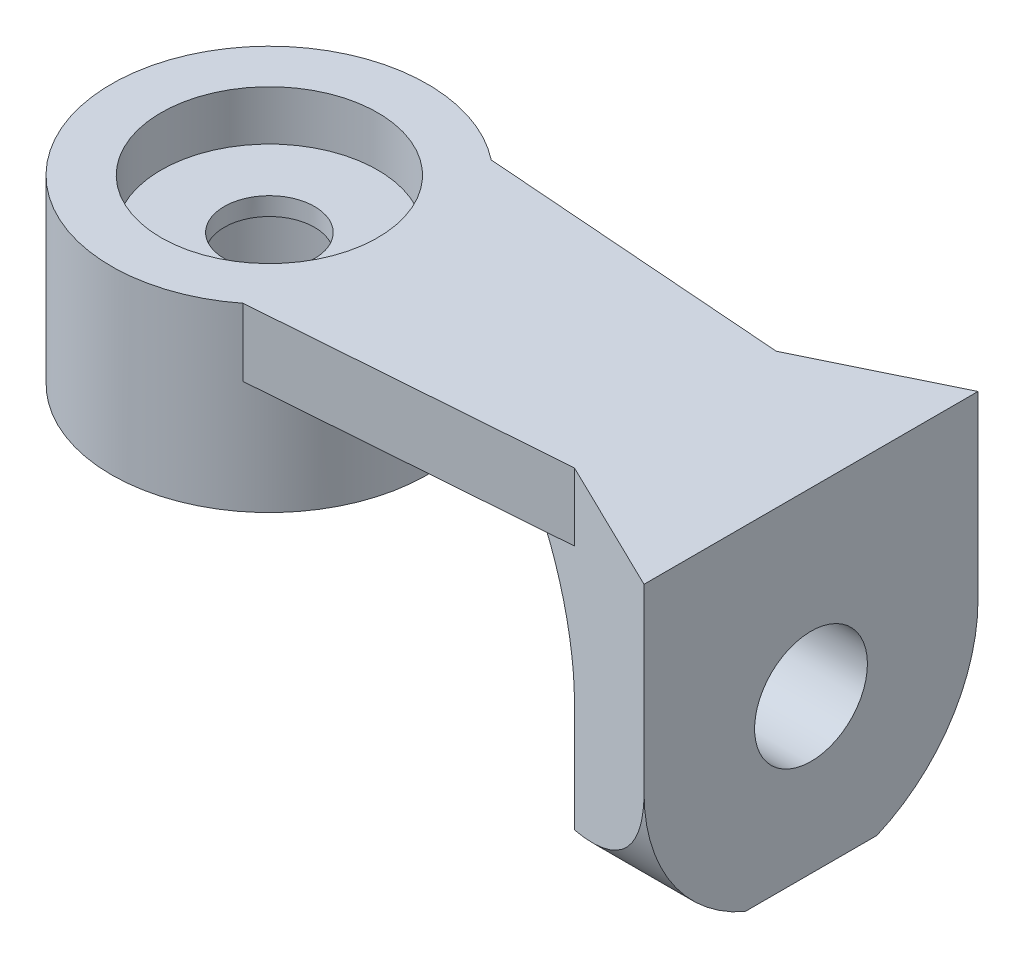
ISO-10303-21;
HEADER;
FILE_DESCRIPTION(('STEP AP214'),'2;1');
FILE_NAME('part.step','',(''),(''),'','','');
FILE_SCHEMA(('AUTOMOTIVE_DESIGN { 1 0 10303 214 1 1 1 1 }'));
ENDSEC;
DATA;
#1=APPLICATION_CONTEXT('core data for automotive mechanical design processes');
#2=APPLICATION_PROTOCOL_DEFINITION('international standard','automotive_design',2000,#1);
#3=PRODUCT_CONTEXT('',#1,'mechanical');
#4=PRODUCT('Part','Part','',(#3));
#5=PRODUCT_RELATED_PRODUCT_CATEGORY('part','',(#4));
#6=PRODUCT_DEFINITION_FORMATION('','',#4);
#7=PRODUCT_DEFINITION_CONTEXT('part definition',#1,'design');
#8=PRODUCT_DEFINITION('design','',#6,#7);
#9=PRODUCT_DEFINITION_SHAPE('','',#8);
#10=(LENGTH_UNIT() NAMED_UNIT(*) SI_UNIT(.MILLI.,.METRE.));
#11=(NAMED_UNIT(*) PLANE_ANGLE_UNIT() SI_UNIT($,.RADIAN.));
#12=(NAMED_UNIT(*) SI_UNIT($,.STERADIAN.) SOLID_ANGLE_UNIT());
#13=UNCERTAINTY_MEASURE_WITH_UNIT(LENGTH_MEASURE(1.E-05),#10,'distance_accuracy_value','');
#14=(GEOMETRIC_REPRESENTATION_CONTEXT(3) GLOBAL_UNCERTAINTY_ASSIGNED_CONTEXT((#13)) GLOBAL_UNIT_ASSIGNED_CONTEXT((#10,
#11,#12)) REPRESENTATION_CONTEXT('',''));
#15=CARTESIAN_POINT('',(0.,0.,0.));
#16=DIRECTION('',(0.,0.,1.));
#17=DIRECTION('',(1.,0.,0.));
#18=AXIS2_PLACEMENT_3D('',#15,#16,#17);
#19=CARTESIAN_POINT('',(12.0000000000011,-3.4,3.69999999999387));
#20=DIRECTION('',(-0.437724250234858,0.,0.899109270754302));
#21=DIRECTION('',(0.899109270754301,0.,0.437724250234858));
#22=AXIS2_PLACEMENT_3D('',#19,#20,#21);
#23=PLANE('',#22);
#24=DIRECTION('',(-0.00082590234464233,0.999999578106783,-0.000402084036206725));
#25=VECTOR('',#24,1.);
#26=CARTESIAN_POINT('',(9.00000253135987,-3.40306496005688,2.23947491657906));
#27=LINE('',#26,#25);
#28=CARTESIAN_POINT('',(8.99962457198454,-2.94543311250702,2.23929091004107));
#29=VERTEX_POINT('',#28);
#30=CARTESIAN_POINT('',(8.99760283584608,-0.497522292765807,2.23830664376314));
#31=VERTEX_POINT('',#30);
#32=EDGE_CURVE('E158',#29,#31,#27,.T.);
#33=ORIENTED_EDGE('',*,*,#32,.F.);
#34=CARTESIAN_POINT('',(4.4,0.,0.));
#35=DIRECTION('',(-0.437724250234858,0.,0.899109270754302));
#36=DIRECTION('',(0.899109270754301,0.,0.437724250234858));
#37=AXIS2_PLACEMENT_3D('',#34,#35,#36);
#38=ELLIPSE('',#37,8.45281018362799,3.70000000000613);
#39=CARTESIAN_POINT('',(12.0000000000011,1.92911441682681E-11,3.69999999999387));
#40=VERTEX_POINT('',#39);
#41=EDGE_CURVE('E255',#29,#40,#38,.T.);
#42=ORIENTED_EDGE('',*,*,#41,.T.);
#43=DIRECTION('',(0.,1.,0.));
#44=VECTOR('',#43,1.);
#45=CARTESIAN_POINT('',(12.0000000000011,-3.4,3.69999999999387));
#46=LINE('',#45,#44);
#47=CARTESIAN_POINT('',(12.0000000000011,4.,3.69999999999387));
#48=VERTEX_POINT('',#47);
#49=EDGE_CURVE('E184',#40,#48,#46,.T.);
#50=ORIENTED_EDGE('',*,*,#49,.T.);
#51=DIRECTION('',(0.899109270754302,0.,0.437724250234858));
#52=VECTOR('',#51,1.);
#53=CARTESIAN_POINT('',(12.0000000000011,4.,3.69999999999387));
#54=LINE('',#53,#52);
#55=CARTESIAN_POINT('',(8.99512717411191,4.,2.23710138739256));
#56=VERTEX_POINT('',#55);
#57=EDGE_CURVE('E176',#56,#48,#54,.T.);
#58=ORIENTED_EDGE('',*,*,#57,.F.);
#59=DIRECTION('',(0.,-1.,0.));
#60=VECTOR('',#59,1.);
#61=CARTESIAN_POINT('',(8.99512717411191,2.5,2.23710138739256));
#62=LINE('',#61,#60);
#63=CARTESIAN_POINT('',(8.99512717411191,2.5,2.23710138739256));
#64=VERTEX_POINT('',#63);
#65=EDGE_CURVE('E189',#56,#64,#62,.T.);
#66=ORIENTED_EDGE('',*,*,#65,.T.);
#67=DIRECTION('',(0.899109270754301,0.,0.437724250234858));
#68=VECTOR('',#67,1.);
#69=CARTESIAN_POINT('',(0.84305108467214,2.5,-1.7316724982486));
#70=LINE('',#69,#68);
#71=CARTESIAN_POINT('',(5.99760385901843,2.5,0.777780826099676));
#72=VERTEX_POINT('',#71);
#73=EDGE_CURVE('E237',#72,#64,#70,.T.);
#74=ORIENTED_EDGE('',*,*,#73,.F.);
#75=CARTESIAN_POINT('',(5.99760385901845,-0.5,0.777780826099685));
#76=DIRECTION('',(-0.437724250234858,0.,0.899109270754302));
#77=DIRECTION('',(0.899109270754301,0.,0.437724250234858));
#78=AXIS2_PLACEMENT_3D('',#75,#76,#77);
#79=ELLIPSE('',#78,3.33663559878898,3.);
#80=EDGE_CURVE('E168',#72,#31,#79,.F.);
#81=ORIENTED_EDGE('',*,*,#80,.T.);
#82=EDGE_LOOP('',(#33,#42,#50,#58,#66,#74,#81));
#83=FACE_BOUND('',#82,.T.);
#84=ADVANCED_FACE('F49',(#83),#23,.T.);
#85=CARTESIAN_POINT('',(4.4,-3.4,0.));
#86=DIRECTION('',(-0.43772425023603,0.,-0.899109270753731));
#87=DIRECTION('',(-0.89910927075373,0.,0.43772425023603));
#88=AXIS2_PLACEMENT_3D('',#85,#86,#87);
#89=PLANE('',#88);
#90=DIRECTION('',(0.,1.,0.));
#91=VECTOR('',#90,1.);
#92=CARTESIAN_POINT('',(12.0000000000011,-3.4,-3.70000000000613));
#93=LINE('',#92,#91);
#94=CARTESIAN_POINT('',(12.0000000000011,0.,-3.70000000000613));
#95=VERTEX_POINT('',#94);
#96=CARTESIAN_POINT('',(12.0000000000011,4.,-3.70000000000613));
#97=VERTEX_POINT('',#96);
#98=EDGE_CURVE('E175',#95,#97,#93,.T.);
#99=ORIENTED_EDGE('',*,*,#98,.F.);
#100=CARTESIAN_POINT('',(4.4,0.,0.));
#101=DIRECTION('',(-0.43772425023603,0.,-0.899109270753731));
#102=DIRECTION('',(0.899109270753731,0.,-0.43772425023603));
#103=AXIS2_PLACEMENT_3D('',#100,#101,#102);
#104=ELLIPSE('',#103,8.45281018360534,3.70000000000613);
#105=CARTESIAN_POINT('',(8.99962457198454,-2.94543311250138,-2.23929091004849));
#106=VERTEX_POINT('',#105);
#107=EDGE_CURVE('E163',#95,#106,#104,.T.);
#108=ORIENTED_EDGE('',*,*,#107,.T.);
#109=DIRECTION('',(0.00082590234464233,-0.999999578106784,-0.000402084036208058));
#110=VECTOR('',#109,1.);
#111=CARTESIAN_POINT('',(8.99999611858433,-3.39530039457945,-2.23947179457734));
#112=LINE('',#111,#110);
#113=CARTESIAN_POINT('',(8.99760283584608,-0.497522292765807,-2.23830664377056));
#114=VERTEX_POINT('',#113);
#115=EDGE_CURVE('E156',#114,#106,#112,.T.);
#116=ORIENTED_EDGE('',*,*,#115,.F.);
#117=CARTESIAN_POINT('',(5.99760385901845,-0.5,-0.777780826102263));
#118=DIRECTION('',(-0.43772425023603,0.,-0.899109270753731));
#119=DIRECTION('',(-0.89910927075373,0.,0.43772425023603));
#120=AXIS2_PLACEMENT_3D('',#117,#118,#119);
#121=ELLIPSE('',#120,3.3366355987911,3.);
#122=CARTESIAN_POINT('',(5.99760385901843,2.5,-0.777780826102253));
#123=VERTEX_POINT('',#122);
#124=EDGE_CURVE('E155',#114,#123,#121,.F.);
#125=ORIENTED_EDGE('',*,*,#124,.T.);
#126=DIRECTION('',(-0.89910927075373,0.,0.43772425023603));
#127=VECTOR('',#126,1.);
#128=CARTESIAN_POINT('',(0.843051084676658,2.5,1.73167249825214));
#129=LINE('',#128,#127);
#130=CARTESIAN_POINT('',(8.99512717409872,2.5,-2.23710138739355));
#131=VERTEX_POINT('',#130);
#132=EDGE_CURVE('E230',#131,#123,#129,.T.);
#133=ORIENTED_EDGE('',*,*,#132,.F.);
#134=DIRECTION('',(0.,1.,0.));
#135=VECTOR('',#134,1.);
#136=CARTESIAN_POINT('',(8.99512717409872,2.5,-2.23710138739355));
#137=LINE('',#136,#135);
#138=CARTESIAN_POINT('',(8.99512717409871,4.,-2.23710138739355));
#139=VERTEX_POINT('',#138);
#140=EDGE_CURVE('E186',#131,#139,#137,.T.);
#141=ORIENTED_EDGE('',*,*,#140,.T.);
#142=DIRECTION('',(-0.89910927075373,0.,0.43772425023603));
#143=VECTOR('',#142,1.);
#144=CARTESIAN_POINT('',(4.4,4.,0.));
#145=LINE('',#144,#143);
#146=EDGE_CURVE('E179',#97,#139,#145,.T.);
#147=ORIENTED_EDGE('',*,*,#146,.F.);
#148=EDGE_LOOP('',(#99,#108,#116,#125,#133,#141,#147));
#149=FACE_BOUND('',#148,.T.);
#150=ADVANCED_FACE('F253',(#149),#89,.T.);
#151=CARTESIAN_POINT('',(12.0000000000011,-3.4,0.));
#152=DIRECTION('',(1.,0.,0.));
#153=DIRECTION('',(0.,0.,-1.));
#154=AXIS2_PLACEMENT_3D('',#151,#152,#153);
#155=PLANE('',#154);
#156=CARTESIAN_POINT('',(12.0000000000011,0.,0.));
#157=DIRECTION('',(1.,0.,0.));
#158=DIRECTION('',(0.,0.,-1.));
#159=AXIS2_PLACEMENT_3D('',#156,#157,#158);
#160=CIRCLE('',#159,1.25);
#161=CARTESIAN_POINT('',(12.0000000000011,0.,-1.25));
#162=VERTEX_POINT('',#161);
#163=EDGE_CURVE('E151',#162,#162,#160,.T.);
#164=ORIENTED_EDGE('',*,*,#163,.F.);
#165=EDGE_LOOP('',(#164));
#166=FACE_BOUND('',#165,.T.);
#167=ORIENTED_EDGE('',*,*,#49,.F.);
#168=CARTESIAN_POINT('',(12.0000000000011,0.,0.));
#169=DIRECTION('',(1.,0.,0.));
#170=DIRECTION('',(0.,0.,-1.));
#171=AXIS2_PLACEMENT_3D('',#168,#169,#170);
#172=CIRCLE('',#171,3.70000000000613);
#173=CARTESIAN_POINT('',(12.0000000000011,-3.4,1.45945195194819));
#174=VERTEX_POINT('',#173);
#175=EDGE_CURVE('E263',#40,#174,#172,.T.);
#176=ORIENTED_EDGE('',*,*,#175,.T.);
#177=DIRECTION('',(0.,0.,-1.));
#178=VECTOR('',#177,1.);
#179=CARTESIAN_POINT('',(12.0000000000011,-3.4,0.));
#180=LINE('',#179,#178);
#181=CARTESIAN_POINT('',(12.0000000000011,-3.4,-1.45945195194819));
#182=VERTEX_POINT('',#181);
#183=EDGE_CURVE('E172',#174,#182,#180,.T.);
#184=ORIENTED_EDGE('',*,*,#183,.T.);
#185=EDGE_CURVE('E150',#182,#95,#172,.T.);
#186=ORIENTED_EDGE('',*,*,#185,.T.);
#187=ORIENTED_EDGE('',*,*,#98,.T.);
#188=DIRECTION('',(0.,0.,-1.));
#189=VECTOR('',#188,1.);
#190=CARTESIAN_POINT('',(12.0000000000011,4.,0.));
#191=LINE('',#190,#189);
#192=EDGE_CURVE('E171',#48,#97,#191,.T.);
#193=ORIENTED_EDGE('',*,*,#192,.F.);
#194=EDGE_LOOP('',(#167,#176,#184,#186,#187,#193));
#195=FACE_BOUND('',#194,.T.);
#196=ADVANCED_FACE('F270',(#166,#195),#155,.T.);
#197=CARTESIAN_POINT('',(0.,-3.4,0.));
#198=DIRECTION('',(0.,-1.,0.));
#199=DIRECTION('',(0.,0.,-1.));
#200=AXIS2_PLACEMENT_3D('',#197,#198,#199);
#201=PLANE('',#200);
#202=DIRECTION('',(0.,0.,1.));
#203=VECTOR('',#202,1.);
#204=CARTESIAN_POINT('',(9.00000000000111,-3.4,0.));
#205=LINE('',#204,#203);
#206=CARTESIAN_POINT('',(9.00000000000111,-3.4,-1.45945195194819));
#207=VERTEX_POINT('',#206);
#208=CARTESIAN_POINT('',(9.00000000000111,-3.4,1.45945195194819));
#209=VERTEX_POINT('',#208);
#210=EDGE_CURVE('E240',#207,#209,#205,.T.);
#211=ORIENTED_EDGE('',*,*,#210,.F.);
#212=DIRECTION('',(1.,0.,0.));
#213=VECTOR('',#212,1.);
#214=CARTESIAN_POINT('',(4.60000000000111,-3.4,-1.45945195194819));
#215=LINE('',#214,#213);
#216=EDGE_CURVE('E74',#207,#182,#215,.T.);
#217=ORIENTED_EDGE('',*,*,#216,.T.);
#218=ORIENTED_EDGE('',*,*,#183,.F.);
#219=DIRECTION('',(1.,0.,0.));
#220=VECTOR('',#219,1.);
#221=CARTESIAN_POINT('',(4.60000000000111,-3.4,1.45945195194819));
#222=LINE('',#221,#220);
#223=EDGE_CURVE('E259',#174,#209,#222,.F.);
#224=ORIENTED_EDGE('',*,*,#223,.T.);
#225=EDGE_LOOP('',(#211,#217,#218,#224));
#226=FACE_BOUND('',#225,.T.);
#227=ADVANCED_FACE('F273',(#226),#201,.T.);
#228=CARTESIAN_POINT('',(8.99718579372691,0.00743079997722582,-3.70000000000613));
#229=DIRECTION('',(0.999999658942545,0.000825902411404804,0.));
#230=DIRECTION('',(-0.000825902411404804,0.999999658942545,0.));
#231=AXIS2_PLACEMENT_3D('',#228,#229,#230);
#232=PLANE('',#231);
#233=DIRECTION('',(0.,0.,1.));
#234=VECTOR('',#233,1.);
#235=CARTESIAN_POINT('',(8.99760283584609,-0.497522292765807,-3.70000000000613));
#236=LINE('',#235,#234);
#237=CARTESIAN_POINT('',(8.99760283584609,-0.497522292765807,1.14672209719751));
#238=VERTEX_POINT('',#237);
#239=EDGE_CURVE('E149',#238,#31,#236,.T.);
#240=ORIENTED_EDGE('',*,*,#239,.F.);
#241=CARTESIAN_POINT('',(8.99719193084462,0.,0.));
#242=DIRECTION('',(0.999999658942545,0.000825902411404804,0.));
#243=DIRECTION('',(0.000825902411404804,-0.999999658942545,0.));
#244=AXIS2_PLACEMENT_3D('',#241,#242,#243);
#245=ELLIPSE('',#244,1.25000042632196,1.25);
#246=CARTESIAN_POINT('',(8.99760283584631,-0.497522292765458,-1.14672209719766));
#247=VERTEX_POINT('',#246);
#248=EDGE_CURVE('E66',#238,#247,#245,.T.);
#249=ORIENTED_EDGE('',*,*,#248,.T.);
#250=EDGE_CURVE('E146',#114,#247,#236,.T.);
#251=ORIENTED_EDGE('',*,*,#250,.F.);
#252=ORIENTED_EDGE('',*,*,#115,.T.);
#253=CARTESIAN_POINT('',(8.99719193084462,0.,0.));
#254=DIRECTION('',(0.999999658942545,0.000825902411404804,0.));
#255=DIRECTION('',(0.000825902411404804,-0.999999658942545,0.));
#256=AXIS2_PLACEMENT_3D('',#253,#254,#255);
#257=ELLIPSE('',#256,3.70000126191914,3.70000000000613);
#258=EDGE_CURVE('E61',#207,#106,#257,.T.);
#259=ORIENTED_EDGE('',*,*,#258,.F.);
#260=ORIENTED_EDGE('',*,*,#210,.T.);
#261=EDGE_CURVE('E243',#29,#209,#257,.T.);
#262=ORIENTED_EDGE('',*,*,#261,.F.);
#263=ORIENTED_EDGE('',*,*,#32,.T.);
#264=EDGE_LOOP('',(#240,#249,#251,#252,#259,#260,#262,#263));
#265=FACE_BOUND('',#264,.T.);
#266=ADVANCED_FACE('F144',(#265),#232,.F.);
#267=CARTESIAN_POINT('',(0.,4.,0.));
#268=DIRECTION('',(0.,1.,0.));
#269=DIRECTION('',(0.,0.,1.));
#270=AXIS2_PLACEMENT_3D('',#267,#268,#269);
#271=PLANE('',#270);
#272=CARTESIAN_POINT('',(0.,4.,0.));
#273=DIRECTION('',(0.,1.,0.));
#274=DIRECTION('',(0.,0.,1.));
#275=AXIS2_PLACEMENT_3D('',#272,#273,#274);
#276=CIRCLE('',#275,2.4);
#277=CARTESIAN_POINT('',(0.,4.,2.4));
#278=VERTEX_POINT('',#277);
#279=EDGE_CURVE('E220',#278,#278,#276,.T.);
#280=ORIENTED_EDGE('',*,*,#279,.F.);
#281=EDGE_LOOP('',(#280));
#282=FACE_BOUND('',#281,.T.);
#283=ORIENTED_EDGE('',*,*,#57,.T.);
#284=ORIENTED_EDGE('',*,*,#192,.T.);
#285=ORIENTED_EDGE('',*,*,#146,.T.);
#286=DIRECTION('',(-0.997192294897433,0.,-0.0748834227128502));
#287=VECTOR('',#286,1.);
#288=CARTESIAN_POINT('',(14.15,4.,-1.85));
#289=LINE('',#288,#287);
#290=CARTESIAN_POINT('',(2.1650635094611,4.,-2.75));
#291=VERTEX_POINT('',#290);
#292=EDGE_CURVE('E197',#139,#291,#289,.T.);
#293=ORIENTED_EDGE('',*,*,#292,.T.);
#294=CARTESIAN_POINT('',(0.,4.,0.));
#295=DIRECTION('',(0.,1.,0.));
#296=DIRECTION('',(0.,0.,1.));
#297=AXIS2_PLACEMENT_3D('',#294,#295,#296);
#298=CIRCLE('',#297,3.5);
#299=CARTESIAN_POINT('',(2.1650635094611,4.,2.75));
#300=VERTEX_POINT('',#299);
#301=EDGE_CURVE('E227',#291,#300,#298,.T.);
#302=ORIENTED_EDGE('',*,*,#301,.T.);
#303=DIRECTION('',(0.997192294897433,0.,-0.0748834227128502));
#304=VECTOR('',#303,1.);
#305=CARTESIAN_POINT('',(14.15,4.,1.85));
#306=LINE('',#305,#304);
#307=EDGE_CURVE('E192',#300,#56,#306,.T.);
#308=ORIENTED_EDGE('',*,*,#307,.T.);
#309=EDGE_LOOP('',(#283,#284,#285,#293,#302,#308));
#310=FACE_BOUND('',#309,.T.);
#311=ADVANCED_FACE('F282',(#282,#310),#271,.T.);
#312=CARTESIAN_POINT('',(14.15,2.5,-1.85));
#313=DIRECTION('',(0.0748834227128502,0.,-0.997192294897433));
#314=DIRECTION('',(-0.997192294897433,0.,-0.0748834227128502));
#315=AXIS2_PLACEMENT_3D('',#312,#313,#314);
#316=PLANE('',#315);
#317=ORIENTED_EDGE('',*,*,#140,.F.);
#318=DIRECTION('',(-0.997192294897433,0.,-0.0748834227128502));
#319=VECTOR('',#318,1.);
#320=CARTESIAN_POINT('',(14.15,2.5,-1.85));
#321=LINE('',#320,#319);
#322=CARTESIAN_POINT('',(2.1650635094611,2.5,-2.75));
#323=VERTEX_POINT('',#322);
#324=EDGE_CURVE('E199',#131,#323,#321,.T.);
#325=ORIENTED_EDGE('',*,*,#324,.T.);
#326=DIRECTION('',(0.,1.,0.));
#327=VECTOR('',#326,1.);
#328=CARTESIAN_POINT('',(2.1650635094611,2.5,-2.75));
#329=LINE('',#328,#327);
#330=EDGE_CURVE('E205',#323,#291,#329,.T.);
#331=ORIENTED_EDGE('',*,*,#330,.T.);
#332=ORIENTED_EDGE('',*,*,#292,.F.);
#333=EDGE_LOOP('',(#317,#325,#331,#332));
#334=FACE_BOUND('',#333,.T.);
#335=ADVANCED_FACE('F287',(#334),#316,.T.);
#336=CARTESIAN_POINT('',(14.15,2.5,1.85));
#337=DIRECTION('',(0.0748834227128502,0.,0.997192294897433));
#338=DIRECTION('',(0.997192294897433,0.,-0.0748834227128502));
#339=AXIS2_PLACEMENT_3D('',#336,#337,#338);
#340=PLANE('',#339);
#341=ORIENTED_EDGE('',*,*,#65,.F.);
#342=ORIENTED_EDGE('',*,*,#307,.F.);
#343=DIRECTION('',(0.,1.,0.));
#344=VECTOR('',#343,1.);
#345=CARTESIAN_POINT('',(2.1650635094611,2.5,2.75));
#346=LINE('',#345,#344);
#347=CARTESIAN_POINT('',(2.1650635094611,2.5,2.75));
#348=VERTEX_POINT('',#347);
#349=EDGE_CURVE('E201',#348,#300,#346,.T.);
#350=ORIENTED_EDGE('',*,*,#349,.F.);
#351=DIRECTION('',(0.997192294897433,0.,-0.0748834227128502));
#352=VECTOR('',#351,1.);
#353=CARTESIAN_POINT('',(14.15,2.5,1.85));
#354=LINE('',#353,#352);
#355=EDGE_CURVE('E196',#348,#64,#354,.T.);
#356=ORIENTED_EDGE('',*,*,#355,.T.);
#357=EDGE_LOOP('',(#341,#342,#350,#356));
#358=FACE_BOUND('',#357,.T.);
#359=ADVANCED_FACE('F297',(#358),#340,.T.);
#360=CARTESIAN_POINT('',(0.,2.5,0.));
#361=DIRECTION('',(0.,1.,0.));
#362=DIRECTION('',(0.,0.,1.));
#363=AXIS2_PLACEMENT_3D('',#360,#361,#362);
#364=PLANE('',#363);
#365=CARTESIAN_POINT('',(0.,2.5,0.));
#366=DIRECTION('',(0.,-1.,0.));
#367=DIRECTION('',(0.,0.,1.));
#368=AXIS2_PLACEMENT_3D('',#365,#366,#367);
#369=CIRCLE('',#368,3.5);
#370=EDGE_CURVE('E193',#323,#348,#369,.T.);
#371=ORIENTED_EDGE('',*,*,#370,.F.);
#372=ORIENTED_EDGE('',*,*,#324,.F.);
#373=ORIENTED_EDGE('',*,*,#132,.T.);
#374=DIRECTION('',(0.,0.,1.));
#375=VECTOR('',#374,1.);
#376=CARTESIAN_POINT('',(5.99760385901843,2.5,-3.70000000000613));
#377=LINE('',#376,#375);
#378=EDGE_CURVE('E160',#123,#72,#377,.T.);
#379=ORIENTED_EDGE('',*,*,#378,.T.);
#380=ORIENTED_EDGE('',*,*,#73,.T.);
#381=ORIENTED_EDGE('',*,*,#355,.F.);
#382=EDGE_LOOP('',(#371,#372,#373,#379,#380,#381));
#383=FACE_BOUND('',#382,.T.);
#384=ADVANCED_FACE('F290',(#383),#364,.F.);
#385=CARTESIAN_POINT('',(0.,0.,0.));
#386=DIRECTION('',(0.,1.,0.));
#387=DIRECTION('',(0.,0.,1.));
#388=AXIS2_PLACEMENT_3D('',#385,#386,#387);
#389=CYLINDRICAL_SURFACE('',#388,1.);
#390=CARTESIAN_POINT('',(0.,2.9,0.));
#391=DIRECTION('',(0.,1.,0.));
#392=DIRECTION('',(0.,0.,1.));
#393=AXIS2_PLACEMENT_3D('',#390,#391,#392);
#394=CIRCLE('',#393,1.);
#395=CARTESIAN_POINT('',(0.,2.9,1.));
#396=VERTEX_POINT('',#395);
#397=EDGE_CURVE('E217',#396,#396,#394,.T.);
#398=ORIENTED_EDGE('',*,*,#397,.T.);
#399=EDGE_LOOP('',(#398));
#400=FACE_BOUND('',#399,.T.);
#401=CARTESIAN_POINT('',(0.,2.5,0.));
#402=DIRECTION('',(0.,-1.,0.));
#403=DIRECTION('',(0.,0.,-1.));
#404=AXIS2_PLACEMENT_3D('',#401,#402,#403);
#405=CIRCLE('',#404,1.);
#406=CARTESIAN_POINT('',(0.,2.5,-1.));
#407=VERTEX_POINT('',#406);
#408=EDGE_CURVE('E214',#407,#407,#405,.F.);
#409=ORIENTED_EDGE('',*,*,#408,.F.);
#410=EDGE_LOOP('',(#409));
#411=FACE_BOUND('',#410,.T.);
#412=ADVANCED_FACE('F305',(#400,#411),#389,.F.);
#413=CARTESIAN_POINT('',(0.,4.,0.));
#414=DIRECTION('',(0.,-1.,0.));
#415=DIRECTION('',(0.,0.,-1.));
#416=AXIS2_PLACEMENT_3D('',#413,#414,#415);
#417=CYLINDRICAL_SURFACE('',#416,3.5);
#418=ORIENTED_EDGE('',*,*,#301,.F.);
#419=ORIENTED_EDGE('',*,*,#330,.F.);
#420=ORIENTED_EDGE('',*,*,#370,.T.);
#421=ORIENTED_EDGE('',*,*,#349,.T.);
#422=EDGE_LOOP('',(#418,#419,#420,#421));
#423=FACE_BOUND('',#422,.T.);
#424=CARTESIAN_POINT('',(0.,0.,0.));
#425=DIRECTION('',(0.,1.,0.));
#426=DIRECTION('',(0.,0.,1.));
#427=AXIS2_PLACEMENT_3D('',#424,#425,#426);
#428=CIRCLE('',#427,3.5);
#429=CARTESIAN_POINT('',(0.,0.,3.5));
#430=VERTEX_POINT('',#429);
#431=EDGE_CURVE('E224',#430,#430,#428,.T.);
#432=ORIENTED_EDGE('',*,*,#431,.T.);
#433=EDGE_LOOP('',(#432));
#434=FACE_BOUND('',#433,.T.);
#435=ADVANCED_FACE('F51',(#423,#434),#417,.T.);
#436=CARTESIAN_POINT('',(0.,0.,0.));
#437=DIRECTION('',(0.,1.,0.));
#438=DIRECTION('',(0.,0.,1.));
#439=AXIS2_PLACEMENT_3D('',#436,#437,#438);
#440=PLANE('',#439);
#441=CARTESIAN_POINT('',(0.,0.,0.));
#442=DIRECTION('',(0.,-1.,0.));
#443=DIRECTION('',(0.,0.,-1.));
#444=AXIS2_PLACEMENT_3D('',#441,#442,#443);
#445=CIRCLE('',#444,2.3);
#446=CARTESIAN_POINT('',(0.,0.,-2.3));
#447=VERTEX_POINT('',#446);
#448=EDGE_CURVE('E208',#447,#447,#445,.T.);
#449=ORIENTED_EDGE('',*,*,#448,.F.);
#450=EDGE_LOOP('',(#449));
#451=FACE_BOUND('',#450,.T.);
#452=ORIENTED_EDGE('',*,*,#431,.F.);
#453=EDGE_LOOP('',(#452));
#454=FACE_BOUND('',#453,.T.);
#455=ADVANCED_FACE('F372',(#451,#454),#440,.F.);
#456=CARTESIAN_POINT('',(0.,2.9,0.));
#457=DIRECTION('',(0.,1.,0.));
#458=DIRECTION('',(0.,0.,1.));
#459=AXIS2_PLACEMENT_3D('',#456,#457,#458);
#460=CYLINDRICAL_SURFACE('',#459,2.4);
#461=CARTESIAN_POINT('',(0.,2.9,0.));
#462=DIRECTION('',(0.,1.,0.));
#463=DIRECTION('',(0.,0.,1.));
#464=AXIS2_PLACEMENT_3D('',#461,#462,#463);
#465=CIRCLE('',#464,2.4);
#466=CARTESIAN_POINT('',(0.,2.9,2.4));
#467=VERTEX_POINT('',#466);
#468=EDGE_CURVE('E221',#467,#467,#465,.T.);
#469=ORIENTED_EDGE('',*,*,#468,.F.);
#470=EDGE_LOOP('',(#469));
#471=FACE_BOUND('',#470,.T.);
#472=ORIENTED_EDGE('',*,*,#279,.T.);
#473=EDGE_LOOP('',(#472));
#474=FACE_BOUND('',#473,.T.);
#475=ADVANCED_FACE('F363',(#471,#474),#460,.F.);
#476=CARTESIAN_POINT('',(0.,2.9,0.));
#477=DIRECTION('',(0.,1.,0.));
#478=DIRECTION('',(0.,0.,1.));
#479=AXIS2_PLACEMENT_3D('',#476,#477,#478);
#480=PLANE('',#479);
#481=ORIENTED_EDGE('',*,*,#397,.F.);
#482=EDGE_LOOP('',(#481));
#483=FACE_BOUND('',#482,.T.);
#484=ORIENTED_EDGE('',*,*,#468,.T.);
#485=EDGE_LOOP('',(#484));
#486=FACE_BOUND('',#485,.T.);
#487=ADVANCED_FACE('F355',(#483,#486),#480,.T.);
#488=CARTESIAN_POINT('',(0.,2.5,0.));
#489=DIRECTION('',(0.,-1.,0.));
#490=DIRECTION('',(0.,0.,-1.));
#491=AXIS2_PLACEMENT_3D('',#488,#489,#490);
#492=PLANE('',#491);
#493=CARTESIAN_POINT('',(0.,2.5,0.));
#494=DIRECTION('',(0.,-1.,0.));
#495=DIRECTION('',(0.,0.,-1.));
#496=AXIS2_PLACEMENT_3D('',#493,#494,#495);
#497=CIRCLE('',#496,2.3);
#498=CARTESIAN_POINT('',(0.,2.5,-2.3));
#499=VERTEX_POINT('',#498);
#500=EDGE_CURVE('E211',#499,#499,#497,.T.);
#501=ORIENTED_EDGE('',*,*,#500,.T.);
#502=EDGE_LOOP('',(#501));
#503=FACE_BOUND('',#502,.T.);
#504=ORIENTED_EDGE('',*,*,#408,.T.);
#505=EDGE_LOOP('',(#504));
#506=FACE_BOUND('',#505,.T.);
#507=ADVANCED_FACE('F346',(#503,#506),#492,.T.);
#508=CARTESIAN_POINT('',(0.,2.5,0.));
#509=DIRECTION('',(0.,-1.,0.));
#510=DIRECTION('',(0.,0.,-1.));
#511=AXIS2_PLACEMENT_3D('',#508,#509,#510);
#512=CYLINDRICAL_SURFACE('',#511,2.3);
#513=ORIENTED_EDGE('',*,*,#500,.F.);
#514=EDGE_LOOP('',(#513));
#515=FACE_BOUND('',#514,.T.);
#516=ORIENTED_EDGE('',*,*,#448,.T.);
#517=EDGE_LOOP('',(#516));
#518=FACE_BOUND('',#517,.T.);
#519=ADVANCED_FACE('F320',(#515,#518),#512,.F.);
#520=CARTESIAN_POINT('',(5.99760385901845,-0.5,-3.70000000000613));
#521=DIRECTION('',(0.,0.,1.));
#522=DIRECTION('',(1.,0.,0.));
#523=AXIS2_PLACEMENT_3D('',#520,#521,#522);
#524=CYLINDRICAL_SURFACE('',#523,3.);
#525=CARTESIAN_POINT('',(8.99760385901845,-0.5,-1.14564392373896));
#526=CARTESIAN_POINT('',(8.99760184302141,-0.563308501535825,-1.11801004800814));
#527=CARTESIAN_POINT('',(8.99558148812525,-0.624399123557786,-1.08507282760933));
#528=CARTESIAN_POINT('',(8.98853431656794,-0.740265137973849,-1.00960889866264));
#529=CARTESIAN_POINT('',(8.98350030063877,-0.79502503208517,-0.96705937954807));
#530=CARTESIAN_POINT('',(8.97171796267573,-0.896548762164375,-0.87374972127767));
#531=CARTESIAN_POINT('',(8.96497418986543,-0.943333274583191,-0.823011498362489));
#532=CARTESIAN_POINT('',(8.95110463191104,-1.02789552077935,-0.714602573985065));
#533=CARTESIAN_POINT('',(8.94397899462836,-1.06567671029804,-0.6569345452135));
#534=CARTESIAN_POINT('',(8.93044815721411,-1.13214624588253,-0.534525606533073));
#535=CARTESIAN_POINT('',(8.92406630339383,-1.1605746863296,-0.46964054249695));
#536=CARTESIAN_POINT('',(8.913416133472,-1.20610966918925,-0.335843884295211));
#537=CARTESIAN_POINT('',(8.90914757840842,-1.22321749175859,-0.266932746365043));
#538=CARTESIAN_POINT('',(8.90355824779224,-1.24535859691073,-0.128204428384936));
#539=CARTESIAN_POINT('',(8.90219156547736,-1.25058001612493,-0.058419203949262));
#540=CARTESIAN_POINT('',(8.90251757779316,-1.24931771043443,0.0810324064085682));
#541=CARTESIAN_POINT('',(8.9042099350917,-1.24283527615915,0.150698804586201));
#542=CARTESIAN_POINT('',(8.91027589502753,-1.21867166225598,0.286320538033161));
#543=CARTESIAN_POINT('',(8.91458892121702,-1.20124320111943,0.352323973103303));
#544=CARTESIAN_POINT('',(8.92510296231709,-1.15596158940312,0.480493879827434));
#545=CARTESIAN_POINT('',(8.93130431100543,-1.12810659564146,0.542659670805414));
#546=CARTESIAN_POINT('',(8.94468565925688,-1.0620196397202,0.662889703627679));
#547=CARTESIAN_POINT('',(8.95188412192127,-1.02357371833398,0.720834259141258));
#548=CARTESIAN_POINT('',(8.96583781294333,-0.937584619492901,0.829603735164024));
#549=CARTESIAN_POINT('',(8.97259297164106,-0.890040016863689,0.880427538149191));
#550=CARTESIAN_POINT('',(8.98439234282728,-0.786131965149312,0.974417180682337));
#551=CARTESIAN_POINT('',(8.98940412512955,-0.729627207551513,1.01743140563953));
#552=CARTESIAN_POINT('',(8.99618294316065,-0.610012674271015,1.09334214685842));
#553=CARTESIAN_POINT('',(8.99795111082805,-0.546905210893474,1.12624218937348));
#554=CARTESIAN_POINT('',(8.99715746195389,-0.418511509587506,1.17983189643289));
#555=CARTESIAN_POINT('',(8.9947563773581,-0.353397113103363,1.20093514243669));
#556=CARTESIAN_POINT('',(8.9853322207237,-0.220925947483327,1.23220131564313));
#557=CARTESIAN_POINT('',(8.9783104560824,-0.153569817750852,1.24236733533362));
#558=CARTESIAN_POINT('',(8.95991671814425,-0.0214896581386825,1.25149739163914));
#559=CARTESIAN_POINT('',(8.94873098353666,0.0432313246782415,1.25089534642795));
#560=CARTESIAN_POINT('',(8.92233172287766,0.170987830359071,1.23990977535658));
#561=CARTESIAN_POINT('',(8.90711756945712,0.234023089010365,1.22952472528715));
#562=CARTESIAN_POINT('',(8.87276018164512,0.358960648885539,1.19913226914243));
#563=CARTESIAN_POINT('',(8.8535034932537,0.420756259633001,1.17881752636797));
#564=CARTESIAN_POINT('',(8.81237232810918,0.539734308164473,1.12931112522665));
#565=CARTESIAN_POINT('',(8.79049698046808,0.596915200586991,1.1001165086769));
#566=CARTESIAN_POINT('',(8.74303146166395,0.711122271128164,1.03039463872501));
#567=CARTESIAN_POINT('',(8.71728776842381,0.767575607376836,0.989032999630487));
#568=CARTESIAN_POINT('',(8.6656929935139,0.872860275749409,0.897490290790259));
#569=CARTESIAN_POINT('',(8.6398418241462,0.921683044571934,0.847299444903412));
#570=CARTESIAN_POINT('',(8.58822285870504,1.01382723927759,0.73504847110519));
#571=CARTESIAN_POINT('',(8.56259105973684,1.05651274312213,0.67239893736959));
#572=CARTESIAN_POINT('',(8.51629355906101,1.13037117862317,0.53902122053702));
#573=CARTESIAN_POINT('',(8.49561860266927,1.16156562406154,0.468308462120104));
#574=CARTESIAN_POINT('',(8.46648678565168,1.20443834142881,0.339412420992762));
#575=CARTESIAN_POINT('',(8.45626067437118,1.2190605815327,0.282604943933178));
#576=CARTESIAN_POINT('',(8.44133735659834,1.24021234917753,0.166813202665931));
#577=CARTESIAN_POINT('',(8.43663433959041,1.24675038201098,0.107831293569443));
#578=CARTESIAN_POINT('',(8.43332373262135,1.25136468055197,-0.0107686793121618));
#579=CARTESIAN_POINT('',(8.43472953657924,1.24942235256732,-0.0703878547744837));
#580=CARTESIAN_POINT('',(8.44348682507086,1.23715570953343,-0.188319594041562));
#581=CARTESIAN_POINT('',(8.45084120862207,1.22682730755376,-0.246631506513182));
#582=CARTESIAN_POINT('',(8.47040310532612,1.19868927683485,-0.359067184665354));
#583=CARTESIAN_POINT('',(8.48249553059367,1.18105652934637,-0.413256307169139));
#584=CARTESIAN_POINT('',(8.51039782840525,1.13905464853844,-0.517917213085772));
#585=CARTESIAN_POINT('',(8.52620898492455,1.11468318801579,-0.568387704635845));
#586=CARTESIAN_POINT('',(8.56277123099583,1.05604249608409,-0.67177800687428));
#587=CARTESIAN_POINT('',(8.58390427190109,1.02086368396503,-0.724045482751448));
#588=CARTESIAN_POINT('',(8.62786569365031,0.943504431309869,-0.822323785893833));
#589=CARTESIAN_POINT('',(8.65069532782666,0.901318785592489,-0.868329915203979));
#590=CARTESIAN_POINT('',(8.70032845131418,0.803362191932103,-0.960375078258338));
#591=CARTESIAN_POINT('',(8.72718106581876,0.74649750945868,-1.00523171117779));
#592=CARTESIAN_POINT('',(8.77931492652838,0.625358632760937,-1.08474693109744));
#593=CARTESIAN_POINT('',(8.8045957867281,0.561082629376269,-1.1194030207006));
#594=CARTESIAN_POINT('',(8.85237400829992,0.424981864688921,-1.17791694760814));
#595=CARTESIAN_POINT('',(8.87480100904073,0.353025972656125,-1.20153032359438));
#596=CARTESIAN_POINT('',(8.91467072047762,0.204698194965853,-1.23546449932817));
#597=CARTESIAN_POINT('',(8.93211580927392,0.12832843725721,-1.24579164949395));
#598=CARTESIAN_POINT('',(8.95957248759323,-0.0185658821598243,-1.25180873276666));
#599=CARTESIAN_POINT('',(8.97014352015395,-0.0889332046777917,-1.24882923287237));
#600=CARTESIAN_POINT('',(8.98612788918476,-0.22863015967998,-1.23091946372595));
#601=CARTESIAN_POINT('',(8.99155323681099,-0.297961835059735,-1.21601717565902));
#602=CARTESIAN_POINT('',(8.99561532409327,-0.388383802529193,-1.18837433771769));
#603=CARTESIAN_POINT('',(8.99636862980557,-0.411040511504998,-1.18072757909688));
#604=CARTESIAN_POINT('',(8.99736321089613,-0.455886762094347,-1.16414706624947));
#605=CARTESIAN_POINT('',(8.99760455715497,-0.478076367956893,-1.15521349036509));
#606=CARTESIAN_POINT('',(8.99760385901845,-0.5,-1.14564392373896));
#607=B_SPLINE_CURVE_WITH_KNOTS('',3,(#525,#526,#527,#528,#529,#530,#531,#532,#533,#534,#535,
#536,#537,#538,#539,#540,#541,#542,#543,#544,#545,#546,#547,#548,#549,#550,#551,#552,#553,#554,
#555,#556,#557,#558,#559,#560,#561,#562,#563,#564,#565,#566,#567,#568,#569,#570,#571,#572,#573,
#574,#575,#576,#577,#578,#579,#580,#581,#582,#583,#584,#585,#586,#587,#588,#589,#590,#591,#592,
#593,#594,#595,#596,#597,#598,#599,#600,#601,#602,#603,#604,#605,#606),.UNSPECIFIED.,.T.,.F.,(4,
2,2,2,2,2,2,2,2,2,2,2,2,2,2,2,2,2,2,2,2,2,2,2,2,2,2,2,2,2,2,2,2,2,2,2,2,2,2,2,4),(0.,
0.207135281726251,0.414767369973498,0.621852696579008,0.828858409227737,1.04120789829913,
1.25353337038546,1.46247409302191,1.67139177636001,1.87565490874922,2.07995416743918,
2.28872898890895,2.49753653868386,2.71004320648828,2.92247570078207,3.12689925617448,
3.33126499584493,3.52741469850488,3.72359496668643,3.9262735155452,4.12901965749367,
4.35178628646083,4.57480114445738,4.81363590464161,5.05202121336704,5.22989551788514,
5.40758252341997,5.58565931362542,5.76382294119931,5.93790337756493,6.11204400756609,
6.31065383047419,6.50941186044009,6.74010496699084,6.97085450719899,7.2064952329814,
7.44202328765557,7.6545572993979,7.86659398030298,7.93833452760742,8.01006514181477),.UNSPECIFIED.);
#608=EDGE_CURVE('E12',#238,#247,#607,.T.);
#609=ORIENTED_EDGE('',*,*,#608,.F.);
#610=ORIENTED_EDGE('',*,*,#239,.T.);
#611=ORIENTED_EDGE('',*,*,#80,.F.);
#612=ORIENTED_EDGE('',*,*,#378,.F.);
#613=ORIENTED_EDGE('',*,*,#124,.F.);
#614=ORIENTED_EDGE('',*,*,#250,.T.);
#615=EDGE_LOOP('',(#609,#610,#611,#612,#613,#614));
#616=FACE_BOUND('',#615,.T.);
#617=ADVANCED_FACE('F153',(#616),#524,.F.);
#618=CARTESIAN_POINT('',(4.60000000000111,0.,0.));
#619=DIRECTION('',(1.,0.,0.));
#620=DIRECTION('',(0.,0.,-1.));
#621=AXIS2_PLACEMENT_3D('',#618,#619,#620);
#622=CYLINDRICAL_SURFACE('',#621,3.70000000000613);
#623=ORIENTED_EDGE('',*,*,#261,.T.);
#624=ORIENTED_EDGE('',*,*,#223,.F.);
#625=ORIENTED_EDGE('',*,*,#175,.F.);
#626=ORIENTED_EDGE('',*,*,#41,.F.);
#627=EDGE_LOOP('',(#623,#624,#625,#626));
#628=FACE_BOUND('',#627,.T.);
#629=ADVANCED_FACE('F280',(#628),#622,.T.);
#630=ORIENTED_EDGE('',*,*,#185,.F.);
#631=ORIENTED_EDGE('',*,*,#216,.F.);
#632=ORIENTED_EDGE('',*,*,#258,.T.);
#633=ORIENTED_EDGE('',*,*,#107,.F.);
#634=EDGE_LOOP('',(#630,#631,#632,#633));
#635=FACE_BOUND('',#634,.T.);
#636=ADVANCED_FACE('F248',(#635),#622,.T.);
#637=CARTESIAN_POINT('',(4.60000000000111,0.,0.));
#638=DIRECTION('',(1.,0.,0.));
#639=DIRECTION('',(0.,0.,-1.));
#640=AXIS2_PLACEMENT_3D('',#637,#638,#639);
#641=CYLINDRICAL_SURFACE('',#640,1.25);
#642=ORIENTED_EDGE('',*,*,#163,.T.);
#643=EDGE_LOOP('',(#642));
#644=FACE_BOUND('',#643,.T.);
#645=ORIENTED_EDGE('',*,*,#608,.T.);
#646=ORIENTED_EDGE('',*,*,#248,.F.);
#647=EDGE_LOOP('',(#645,#646));
#648=FACE_BOUND('',#647,.T.);
#649=ADVANCED_FACE('F138',(#644,#648),#641,.F.);
#650=CLOSED_SHELL('',(#84,#150,#196,#227,#266,#311,#335,#359,#384,#412,#435,#455,#475,#487,#507,
#519,#617,#629,#636,#649));
#651=MANIFOLD_SOLID_BREP('B2',#650);
#652=ADVANCED_BREP_SHAPE_REPRESENTATION('',(#18,#651),#14);
#653=SHAPE_DEFINITION_REPRESENTATION(#9,#652);
ENDSEC;
END-ISO-10303-21;
